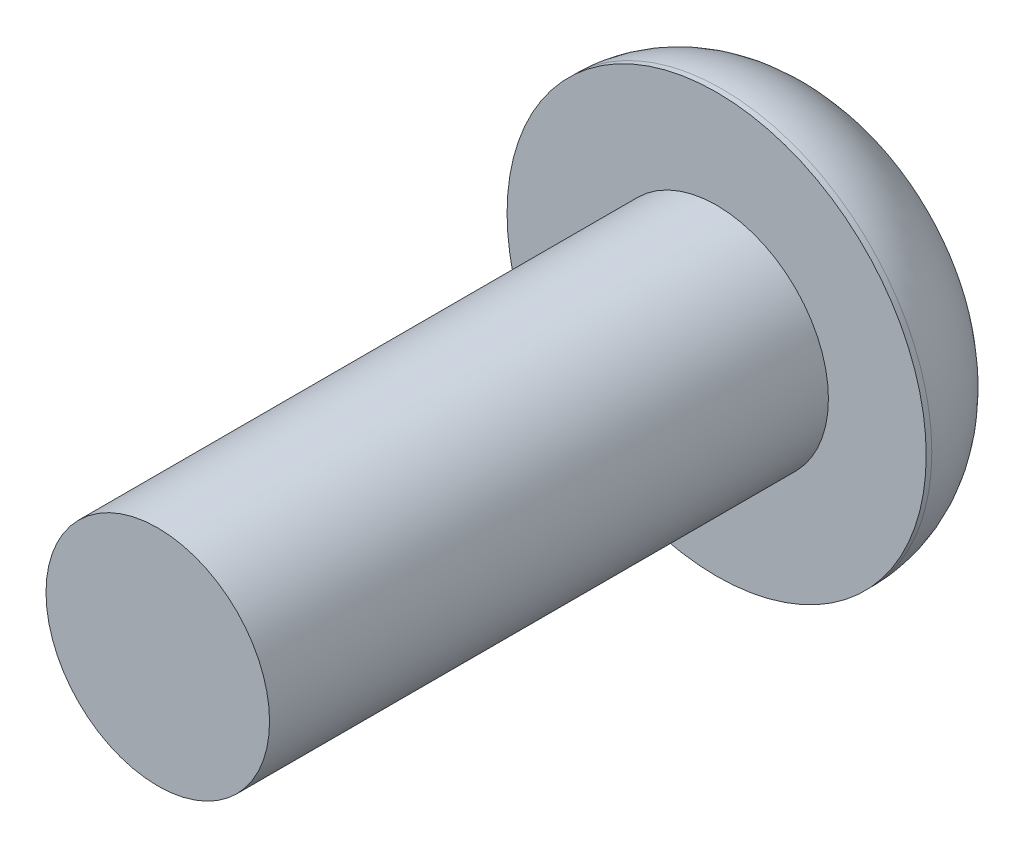
ISO-10303-21;
HEADER;
FILE_DESCRIPTION(('STEP AP214'),'2;1');
FILE_NAME('part.step','',(''),(''),'','','');
FILE_SCHEMA(('AUTOMOTIVE_DESIGN { 1 0 10303 214 1 1 1 1 }'));
ENDSEC;
DATA;
#1=APPLICATION_CONTEXT('core data for automotive mechanical design processes');
#2=APPLICATION_PROTOCOL_DEFINITION('international standard','automotive_design',2000,#1);
#3=PRODUCT_CONTEXT('',#1,'mechanical');
#4=PRODUCT('Part','Part','',(#3));
#5=PRODUCT_RELATED_PRODUCT_CATEGORY('part','',(#4));
#6=PRODUCT_DEFINITION_FORMATION('','',#4);
#7=PRODUCT_DEFINITION_CONTEXT('part definition',#1,'design');
#8=PRODUCT_DEFINITION('design','',#6,#7);
#9=PRODUCT_DEFINITION_SHAPE('','',#8);
#10=(LENGTH_UNIT() NAMED_UNIT(*) SI_UNIT(.MILLI.,.METRE.));
#11=(NAMED_UNIT(*) PLANE_ANGLE_UNIT() SI_UNIT($,.RADIAN.));
#12=(NAMED_UNIT(*) SI_UNIT($,.STERADIAN.) SOLID_ANGLE_UNIT());
#13=UNCERTAINTY_MEASURE_WITH_UNIT(LENGTH_MEASURE(1.E-05),#10,'distance_accuracy_value','');
#14=(GEOMETRIC_REPRESENTATION_CONTEXT(3) GLOBAL_UNCERTAINTY_ASSIGNED_CONTEXT((#13)) GLOBAL_UNIT_ASSIGNED_CONTEXT((#10,
#11,#12)) REPRESENTATION_CONTEXT('',''));
#15=CARTESIAN_POINT('',(0.,0.,0.));
#16=DIRECTION('',(0.,0.,1.));
#17=DIRECTION('',(1.,0.,0.));
#18=AXIS2_PLACEMENT_3D('',#15,#16,#17);
#19=CARTESIAN_POINT('',(0.,0.,10.));
#20=DIRECTION('',(0.,0.,-1.));
#21=DIRECTION('',(-1.,0.,0.));
#22=AXIS2_PLACEMENT_3D('',#19,#20,#21);
#23=CYLINDRICAL_SURFACE('',#22,2.);
#24=CARTESIAN_POINT('',(0.,0.,10.));
#25=DIRECTION('',(0.,0.,1.));
#26=DIRECTION('',(1.,0.,0.));
#27=AXIS2_PLACEMENT_3D('',#24,#25,#26);
#28=CIRCLE('',#27,2.);
#29=CARTESIAN_POINT('',(2.,0.,10.));
#30=VERTEX_POINT('',#29);
#31=EDGE_CURVE('E50',#30,#30,#28,.T.);
#32=ORIENTED_EDGE('',*,*,#31,.F.);
#33=EDGE_LOOP('',(#32));
#34=FACE_BOUND('',#33,.T.);
#35=CARTESIAN_POINT('',(0.,0.,0.));
#36=DIRECTION('',(0.,0.,1.));
#37=DIRECTION('',(1.,0.,0.));
#38=AXIS2_PLACEMENT_3D('',#35,#36,#37);
#39=CIRCLE('',#38,2.);
#40=CARTESIAN_POINT('',(2.,0.,0.));
#41=VERTEX_POINT('',#40);
#42=EDGE_CURVE('E55',#41,#41,#39,.T.);
#43=ORIENTED_EDGE('',*,*,#42,.T.);
#44=EDGE_LOOP('',(#43));
#45=FACE_BOUND('',#44,.T.);
#46=ADVANCED_FACE('F37',(#34,#45),#23,.T.);
#47=CARTESIAN_POINT('',(0.,0.,10.));
#48=DIRECTION('',(0.,0.,1.));
#49=DIRECTION('',(1.,0.,0.));
#50=AXIS2_PLACEMENT_3D('',#47,#48,#49);
#51=PLANE('',#50);
#52=ORIENTED_EDGE('',*,*,#31,.T.);
#53=EDGE_LOOP('',(#52));
#54=FACE_BOUND('',#53,.T.);
#55=ADVANCED_FACE('F82',(#54),#51,.T.);
#56=CARTESIAN_POINT('',(0.,0.,-2.1));
#57=DIRECTION('',(0.,0.,1.));
#58=DIRECTION('',(1.,0.,0.));
#59=AXIS2_PLACEMENT_3D('',#56,#57,#58);
#60=CYLINDRICAL_SURFACE('',#59,3.75);
#61=CARTESIAN_POINT('',(0.,0.,-0.1));
#62=DIRECTION('',(0.,0.,-1.));
#63=DIRECTION('',(-1.,0.,0.));
#64=AXIS2_PLACEMENT_3D('',#61,#62,#63);
#65=CIRCLE('',#64,3.75);
#66=CARTESIAN_POINT('',(-3.75,0.,-0.1));
#67=VERTEX_POINT('',#66);
#68=EDGE_CURVE('E10',#67,#67,#65,.F.);
#69=ORIENTED_EDGE('',*,*,#68,.T.);
#70=EDGE_LOOP('',(#69));
#71=FACE_BOUND('',#70,.T.);
#72=CARTESIAN_POINT('',(0.,0.,0.));
#73=DIRECTION('',(0.,0.,-1.));
#74=DIRECTION('',(-1.,0.,0.));
#75=AXIS2_PLACEMENT_3D('',#72,#73,#74);
#76=CIRCLE('',#75,3.75);
#77=CARTESIAN_POINT('',(-3.75,0.,0.));
#78=VERTEX_POINT('',#77);
#79=EDGE_CURVE('E60',#78,#78,#76,.T.);
#80=ORIENTED_EDGE('',*,*,#79,.T.);
#81=EDGE_LOOP('',(#80));
#82=FACE_BOUND('',#81,.T.);
#83=ADVANCED_FACE('F66',(#71,#82),#60,.T.);
#84=CARTESIAN_POINT('',(0.,0.,-2.1));
#85=DIRECTION('',(0.,0.,-1.));
#86=DIRECTION('',(-1.,0.,0.));
#87=AXIS2_PLACEMENT_3D('',#84,#85,#86);
#88=PLANE('',#87);
#89=CARTESIAN_POINT('',(0.,0.,-2.1));
#90=DIRECTION('',(0.,0.,-1.));
#91=DIRECTION('',(-1.,0.,0.));
#92=AXIS2_PLACEMENT_3D('',#89,#90,#91);
#93=CIRCLE('',#92,1.75);
#94=CARTESIAN_POINT('',(-1.75,0.,-2.1));
#95=VERTEX_POINT('',#94);
#96=EDGE_CURVE('E45',#95,#95,#93,.T.);
#97=ORIENTED_EDGE('',*,*,#96,.T.);
#98=EDGE_LOOP('',(#97));
#99=FACE_BOUND('',#98,.T.);
#100=ADVANCED_FACE('F70',(#99),#88,.T.);
#101=CARTESIAN_POINT('',(0.,0.,0.));
#102=DIRECTION('',(0.,0.,-1.));
#103=DIRECTION('',(-1.,0.,0.));
#104=AXIS2_PLACEMENT_3D('',#101,#102,#103);
#105=PLANE('',#104);
#106=ORIENTED_EDGE('',*,*,#42,.F.);
#107=EDGE_LOOP('',(#106));
#108=FACE_BOUND('',#107,.T.);
#109=ORIENTED_EDGE('',*,*,#79,.F.);
#110=EDGE_LOOP('',(#109));
#111=FACE_BOUND('',#110,.T.);
#112=ADVANCED_FACE('F68',(#108,#111),#105,.F.);
#113=CARTESIAN_POINT('',(0.,0.,-0.1));
#114=DIRECTION('',(0.,0.,-1.));
#115=DIRECTION('',(-1.,0.,0.));
#116=AXIS2_PLACEMENT_3D('',#113,#114,#115);
#117=DEGENERATE_TOROIDAL_SURFACE('',#116,1.75,2.,.T.);
#118=ORIENTED_EDGE('',*,*,#68,.F.);
#119=EDGE_LOOP('',(#118));
#120=FACE_BOUND('',#119,.T.);
#121=ORIENTED_EDGE('',*,*,#96,.F.);
#122=EDGE_LOOP('',(#121));
#123=FACE_BOUND('',#122,.T.);
#124=ADVANCED_FACE('F39',(#120,#123),#117,.T.);
#125=CLOSED_SHELL('',(#46,#55,#83,#100,#112,#124));
#126=MANIFOLD_SOLID_BREP('B2',#125);
#127=ADVANCED_BREP_SHAPE_REPRESENTATION('',(#18,#126),#14);
#128=SHAPE_DEFINITION_REPRESENTATION(#9,#127);
ENDSEC;
END-ISO-10303-21;
